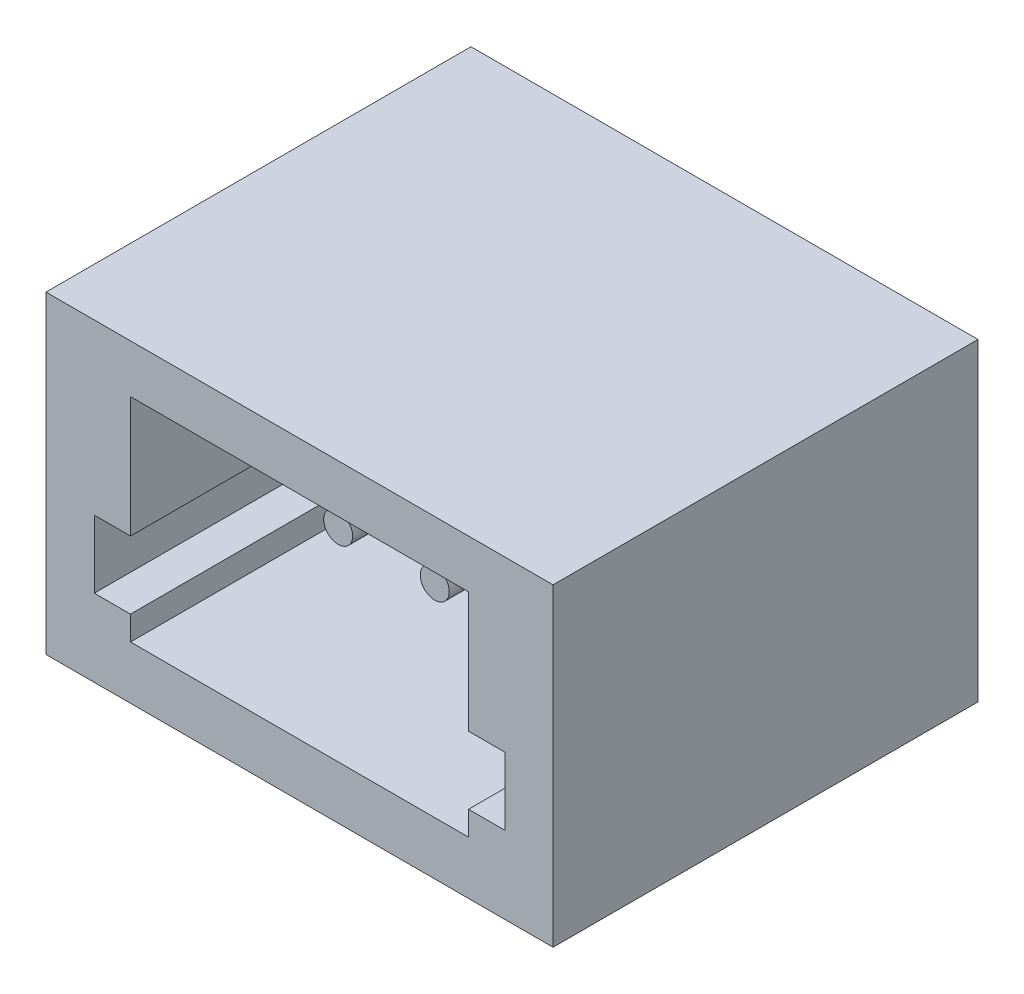
ISO-10303-21;
HEADER;
FILE_DESCRIPTION(('STEP AP214'),'2;1');
FILE_NAME('part.step','',(''),(''),'','','');
FILE_SCHEMA(('AUTOMOTIVE_DESIGN { 1 0 10303 214 1 1 1 1 }'));
ENDSEC;
DATA;
#1=APPLICATION_CONTEXT('core data for automotive mechanical design processes');
#2=APPLICATION_PROTOCOL_DEFINITION('international standard','automotive_design',2000,#1);
#3=PRODUCT_CONTEXT('',#1,'mechanical');
#4=PRODUCT('Part','Part','',(#3));
#5=PRODUCT_RELATED_PRODUCT_CATEGORY('part','',(#4));
#6=PRODUCT_DEFINITION_FORMATION('','',#4);
#7=PRODUCT_DEFINITION_CONTEXT('part definition',#1,'design');
#8=PRODUCT_DEFINITION('design','',#6,#7);
#9=PRODUCT_DEFINITION_SHAPE('','',#8);
#10=(LENGTH_UNIT() NAMED_UNIT(*) SI_UNIT(.MILLI.,.METRE.));
#11=(NAMED_UNIT(*) PLANE_ANGLE_UNIT() SI_UNIT($,.RADIAN.));
#12=(NAMED_UNIT(*) SI_UNIT($,.STERADIAN.) SOLID_ANGLE_UNIT());
#13=UNCERTAINTY_MEASURE_WITH_UNIT(LENGTH_MEASURE(1.E-05),#10,'distance_accuracy_value','');
#14=(GEOMETRIC_REPRESENTATION_CONTEXT(3) GLOBAL_UNCERTAINTY_ASSIGNED_CONTEXT((#13)) GLOBAL_UNIT_ASSIGNED_CONTEXT((#10,
#11,#12)) REPRESENTATION_CONTEXT('',''));
#15=CARTESIAN_POINT('',(0.,0.,0.));
#16=DIRECTION('',(0.,0.,1.));
#17=DIRECTION('',(1.,0.,0.));
#18=AXIS2_PLACEMENT_3D('',#15,#16,#17);
#19=CARTESIAN_POINT('',(62.80997635699,13.55049408494,-10.15));
#20=DIRECTION('',(1.,0.,0.));
#21=DIRECTION('',(0.,0.,-1.));
#22=AXIS2_PLACEMENT_3D('',#19,#20,#21);
#23=PLANE('',#22);
#24=DIRECTION('',(0.,-1.,0.));
#25=VECTOR('',#24,1.);
#26=CARTESIAN_POINT('',(62.80997635699,13.55049408494,-5.75));
#27=LINE('',#26,#25);
#28=CARTESIAN_POINT('',(62.80997635699,13.55049408494,-5.75));
#29=VERTEX_POINT('',#28);
#30=CARTESIAN_POINT('',(62.80997635699,10.30049408494,-5.75));
#31=VERTEX_POINT('',#30);
#32=EDGE_CURVE('E11',#29,#31,#27,.T.);
#33=ORIENTED_EDGE('',*,*,#32,.T.);
#34=DIRECTION('',(0.,0.,-1.));
#35=VECTOR('',#34,1.);
#36=CARTESIAN_POINT('',(62.80997635699,10.30049408494,-5.75));
#37=LINE('',#36,#35);
#38=CARTESIAN_POINT('',(62.80997635699,10.30049408494,-10.15));
#39=VERTEX_POINT('',#38);
#40=EDGE_CURVE('E27',#31,#39,#37,.T.);
#41=ORIENTED_EDGE('',*,*,#40,.T.);
#42=DIRECTION('',(0.,-1.,0.));
#43=VECTOR('',#42,1.);
#44=CARTESIAN_POINT('',(62.80997635699,13.55049408494,-10.15));
#45=LINE('',#44,#43);
#46=CARTESIAN_POINT('',(62.80997635699,13.55049408494,-10.15));
#47=VERTEX_POINT('',#46);
#48=EDGE_CURVE('E462',#47,#39,#45,.T.);
#49=ORIENTED_EDGE('',*,*,#48,.F.);
#50=DIRECTION('',(0.,0.,-1.));
#51=VECTOR('',#50,1.);
#52=CARTESIAN_POINT('',(62.80997635699,13.55049408494,-5.75));
#53=LINE('',#52,#51);
#54=EDGE_CURVE('E530',#29,#47,#53,.T.);
#55=ORIENTED_EDGE('',*,*,#54,.F.);
#56=EDGE_LOOP('',(#33,#41,#49,#55));
#57=FACE_BOUND('',#56,.T.);
#58=ADVANCED_FACE('F17',(#57),#23,.T.);
#59=CARTESIAN_POINT('',(57.55997635699,13.55049408494,-10.15));
#60=DIRECTION('',(0.,1.,0.));
#61=DIRECTION('',(0.,0.,1.));
#62=AXIS2_PLACEMENT_3D('',#59,#60,#61);
#63=PLANE('',#62);
#64=ORIENTED_EDGE('',*,*,#54,.T.);
#65=DIRECTION('',(1.,0.,0.));
#66=VECTOR('',#65,1.);
#67=CARTESIAN_POINT('',(57.55997635699,13.55049408494,-10.15));
#68=LINE('',#67,#66);
#69=CARTESIAN_POINT('',(57.55997635699,13.55049408494,-10.15));
#70=VERTEX_POINT('',#69);
#71=EDGE_CURVE('E459',#70,#47,#68,.T.);
#72=ORIENTED_EDGE('',*,*,#71,.F.);
#73=DIRECTION('',(0.,0.,-1.));
#74=VECTOR('',#73,1.);
#75=CARTESIAN_POINT('',(57.55997635699,13.55049408494,-5.75));
#76=LINE('',#75,#74);
#77=CARTESIAN_POINT('',(57.55997635699,13.55049408494,-5.75));
#78=VERTEX_POINT('',#77);
#79=EDGE_CURVE('E526',#78,#70,#76,.T.);
#80=ORIENTED_EDGE('',*,*,#79,.F.);
#81=DIRECTION('',(1.,0.,0.));
#82=VECTOR('',#81,1.);
#83=CARTESIAN_POINT('',(57.55997635699,13.55049408494,-5.75));
#84=LINE('',#83,#82);
#85=EDGE_CURVE('E525',#78,#29,#84,.T.);
#86=ORIENTED_EDGE('',*,*,#85,.T.);
#87=EDGE_LOOP('',(#64,#72,#80,#86));
#88=FACE_BOUND('',#87,.T.);
#89=ADVANCED_FACE('F195',(#88),#63,.T.);
#90=CARTESIAN_POINT('',(49.99345093786,14.29155013054,-5.75));
#91=DIRECTION('',(0.,0.,1.));
#92=DIRECTION('',(1.,0.,0.));
#93=AXIS2_PLACEMENT_3D('',#90,#91,#92);
#94=PLANE('',#93);
#95=DIRECTION('',(-1.,0.,0.));
#96=VECTOR('',#95,1.);
#97=CARTESIAN_POINT('',(62.80997635699,10.30049408494,-5.75));
#98=LINE('',#97,#96);
#99=CARTESIAN_POINT('',(57.55997635699,10.30049408494,-5.75));
#100=VERTEX_POINT('',#99);
#101=EDGE_CURVE('E458',#31,#100,#98,.T.);
#102=ORIENTED_EDGE('',*,*,#101,.F.);
#103=ORIENTED_EDGE('',*,*,#32,.F.);
#104=ORIENTED_EDGE('',*,*,#85,.F.);
#105=DIRECTION('',(0.,1.,0.));
#106=VECTOR('',#105,1.);
#107=CARTESIAN_POINT('',(57.55997635699,10.30049408494,-5.75));
#108=LINE('',#107,#106);
#109=EDGE_CURVE('E522',#100,#78,#108,.T.);
#110=ORIENTED_EDGE('',*,*,#109,.F.);
#111=EDGE_LOOP('',(#102,#103,#104,#110));
#112=FACE_BOUND('',#111,.T.);
#113=DIRECTION('',(0.,-1.,0.));
#114=VECTOR('',#113,1.);
#115=CARTESIAN_POINT('',(58.43497635699,13.05049408494,-5.75));
#116=LINE('',#115,#114);
#117=CARTESIAN_POINT('',(58.43497635699,13.05049408494,-5.75));
#118=VERTEX_POINT('',#117);
#119=CARTESIAN_POINT('',(58.43497635699,11.80049408494,-5.75));
#120=VERTEX_POINT('',#119);
#121=EDGE_CURVE('E468',#118,#120,#116,.T.);
#122=ORIENTED_EDGE('',*,*,#121,.F.);
#123=DIRECTION('',(-1.,0.,0.));
#124=VECTOR('',#123,1.);
#125=CARTESIAN_POINT('',(61.93497635699,13.05049408494,-5.75));
#126=LINE('',#125,#124);
#127=CARTESIAN_POINT('',(61.93497635699,13.05049408494,-5.75));
#128=VERTEX_POINT('',#127);
#129=EDGE_CURVE('E474',#128,#118,#126,.T.);
#130=ORIENTED_EDGE('',*,*,#129,.F.);
#131=DIRECTION('',(0.,1.,0.));
#132=VECTOR('',#131,1.);
#133=CARTESIAN_POINT('',(61.93497635699,11.80049408494,-5.75));
#134=LINE('',#133,#132);
#135=CARTESIAN_POINT('',(61.93497635699,11.80049408494,-5.75));
#136=VERTEX_POINT('',#135);
#137=EDGE_CURVE('E481',#136,#128,#134,.T.);
#138=ORIENTED_EDGE('',*,*,#137,.F.);
#139=DIRECTION('',(-1.,0.,0.));
#140=VECTOR('',#139,1.);
#141=CARTESIAN_POINT('',(62.30997635699,11.80049408494,-5.75));
#142=LINE('',#141,#140);
#143=CARTESIAN_POINT('',(62.30997635699,11.80049408494,-5.75));
#144=VERTEX_POINT('',#143);
#145=EDGE_CURVE('E488',#144,#136,#142,.T.);
#146=ORIENTED_EDGE('',*,*,#145,.F.);
#147=DIRECTION('',(0.,1.,0.));
#148=VECTOR('',#147,1.);
#149=CARTESIAN_POINT('',(62.30997635699,11.10049408494,-5.75));
#150=LINE('',#149,#148);
#151=CARTESIAN_POINT('',(62.30997635699,11.10049408494,-5.75));
#152=VERTEX_POINT('',#151);
#153=EDGE_CURVE('E495',#152,#144,#150,.T.);
#154=ORIENTED_EDGE('',*,*,#153,.F.);
#155=DIRECTION('',(1.,0.,0.));
#156=VECTOR('',#155,1.);
#157=CARTESIAN_POINT('',(61.93497635699,11.10049408494,-5.75));
#158=LINE('',#157,#156);
#159=CARTESIAN_POINT('',(61.93497635699,11.10049408494,-5.75));
#160=VERTEX_POINT('',#159);
#161=EDGE_CURVE('E502',#160,#152,#158,.T.);
#162=ORIENTED_EDGE('',*,*,#161,.F.);
#163=DIRECTION('',(0.,1.,0.));
#164=VECTOR('',#163,1.);
#165=CARTESIAN_POINT('',(61.93497635699,10.85049408494,-5.75));
#166=LINE('',#165,#164);
#167=CARTESIAN_POINT('',(61.93497635699,10.85049408494,-5.75));
#168=VERTEX_POINT('',#167);
#169=EDGE_CURVE('E508',#168,#160,#166,.T.);
#170=ORIENTED_EDGE('',*,*,#169,.F.);
#171=DIRECTION('',(1.,0.,0.));
#172=VECTOR('',#171,1.);
#173=CARTESIAN_POINT('',(58.43497635699,10.85049408494,-5.75));
#174=LINE('',#173,#172);
#175=CARTESIAN_POINT('',(58.43497635699,10.85049408494,-5.75));
#176=VERTEX_POINT('',#175);
#177=EDGE_CURVE('E433',#176,#168,#174,.T.);
#178=ORIENTED_EDGE('',*,*,#177,.F.);
#179=DIRECTION('',(0.,-1.,0.));
#180=VECTOR('',#179,1.);
#181=CARTESIAN_POINT('',(58.43497635699,11.10049408494,-5.75));
#182=LINE('',#181,#180);
#183=CARTESIAN_POINT('',(58.43497635699,11.10049408494,-5.75));
#184=VERTEX_POINT('',#183);
#185=EDGE_CURVE('E431',#184,#176,#182,.T.);
#186=ORIENTED_EDGE('',*,*,#185,.F.);
#187=DIRECTION('',(1.,0.,0.));
#188=VECTOR('',#187,1.);
#189=CARTESIAN_POINT('',(58.05997635699,11.10049408494,-5.75));
#190=LINE('',#189,#188);
#191=CARTESIAN_POINT('',(58.05997635699,11.10049408494,-5.75));
#192=VERTEX_POINT('',#191);
#193=EDGE_CURVE('E147',#192,#184,#190,.T.);
#194=ORIENTED_EDGE('',*,*,#193,.F.);
#195=DIRECTION('',(0.,-1.,0.));
#196=VECTOR('',#195,1.);
#197=CARTESIAN_POINT('',(58.05997635699,11.80049408494,-5.75));
#198=LINE('',#197,#196);
#199=CARTESIAN_POINT('',(58.05997635699,11.80049408494,-5.75));
#200=VERTEX_POINT('',#199);
#201=EDGE_CURVE('E145',#200,#192,#198,.T.);
#202=ORIENTED_EDGE('',*,*,#201,.F.);
#203=DIRECTION('',(-1.,0.,0.));
#204=VECTOR('',#203,1.);
#205=CARTESIAN_POINT('',(58.43497635699,11.80049408494,-5.75));
#206=LINE('',#205,#204);
#207=EDGE_CURVE('E446',#120,#200,#206,.T.);
#208=ORIENTED_EDGE('',*,*,#207,.F.);
#209=EDGE_LOOP('',(#122,#130,#138,#146,#154,#162,#170,#178,#186,#194,#202,#208));
#210=FACE_BOUND('',#209,.T.);
#211=ADVANCED_FACE('F201',(#112,#210),#94,.T.);
#212=CARTESIAN_POINT('',(57.55997635699,10.30049408494,-10.15));
#213=DIRECTION('',(-1.,0.,0.));
#214=DIRECTION('',(0.,0.,1.));
#215=AXIS2_PLACEMENT_3D('',#212,#213,#214);
#216=PLANE('',#215);
#217=ORIENTED_EDGE('',*,*,#109,.T.);
#218=ORIENTED_EDGE('',*,*,#79,.T.);
#219=DIRECTION('',(0.,1.,0.));
#220=VECTOR('',#219,1.);
#221=CARTESIAN_POINT('',(57.55997635699,10.30049408494,-10.15));
#222=LINE('',#221,#220);
#223=CARTESIAN_POINT('',(57.55997635699,10.30049408494,-10.15));
#224=VERTEX_POINT('',#223);
#225=EDGE_CURVE('E451',#224,#70,#222,.T.);
#226=ORIENTED_EDGE('',*,*,#225,.F.);
#227=DIRECTION('',(0.,0.,-1.));
#228=VECTOR('',#227,1.);
#229=CARTESIAN_POINT('',(57.55997635699,10.30049408494,-5.75));
#230=LINE('',#229,#228);
#231=EDGE_CURVE('E455',#100,#224,#230,.T.);
#232=ORIENTED_EDGE('',*,*,#231,.F.);
#233=EDGE_LOOP('',(#217,#218,#226,#232));
#234=FACE_BOUND('',#233,.T.);
#235=ADVANCED_FACE('F207',(#234),#216,.T.);
#236=CARTESIAN_POINT('',(62.80997635699,10.30049408494,-10.15));
#237=DIRECTION('',(0.,-1.,0.));
#238=DIRECTION('',(0.,0.,-1.));
#239=AXIS2_PLACEMENT_3D('',#236,#237,#238);
#240=PLANE('',#239);
#241=ORIENTED_EDGE('',*,*,#101,.T.);
#242=ORIENTED_EDGE('',*,*,#231,.T.);
#243=DIRECTION('',(-1.,0.,0.));
#244=VECTOR('',#243,1.);
#245=CARTESIAN_POINT('',(62.80997635699,10.30049408494,-10.15));
#246=LINE('',#245,#244);
#247=EDGE_CURVE('E454',#39,#224,#246,.T.);
#248=ORIENTED_EDGE('',*,*,#247,.F.);
#249=ORIENTED_EDGE('',*,*,#40,.F.);
#250=EDGE_LOOP('',(#241,#242,#248,#249));
#251=FACE_BOUND('',#250,.T.);
#252=ADVANCED_FACE('F211',(#251),#240,.T.);
#253=CARTESIAN_POINT('',(49.99345093786,14.29155013054,-10.15));
#254=DIRECTION('',(0.,0.,1.));
#255=DIRECTION('',(1.,0.,0.));
#256=AXIS2_PLACEMENT_3D('',#253,#254,#255);
#257=PLANE('',#256);
#258=ORIENTED_EDGE('',*,*,#71,.T.);
#259=ORIENTED_EDGE('',*,*,#48,.T.);
#260=ORIENTED_EDGE('',*,*,#247,.T.);
#261=ORIENTED_EDGE('',*,*,#225,.T.);
#262=EDGE_LOOP('',(#258,#259,#260,#261));
#263=FACE_BOUND('',#262,.T.);
#264=ADVANCED_FACE('F215',(#263),#257,.F.);
#265=CARTESIAN_POINT('',(58.43497635699,11.80049408494,-5.75));
#266=DIRECTION('',(0.,1.,0.));
#267=DIRECTION('',(-1.,0.,0.));
#268=AXIS2_PLACEMENT_3D('',#265,#266,#267);
#269=PLANE('',#268);
#270=DIRECTION('',(0.,0.,-1.));
#271=VECTOR('',#270,1.);
#272=CARTESIAN_POINT('',(58.05997635699,11.80049408494,-5.75));
#273=LINE('',#272,#271);
#274=CARTESIAN_POINT('',(58.05997635699,11.80049408494,-9.15));
#275=VERTEX_POINT('',#274);
#276=EDGE_CURVE('E449',#200,#275,#273,.T.);
#277=ORIENTED_EDGE('',*,*,#276,.T.);
#278=DIRECTION('',(-1.,0.,0.));
#279=VECTOR('',#278,1.);
#280=CARTESIAN_POINT('',(58.43497635699,11.80049408494,-9.15));
#281=LINE('',#280,#279);
#282=CARTESIAN_POINT('',(58.43497635699,11.80049408494,-9.15));
#283=VERTEX_POINT('',#282);
#284=EDGE_CURVE('E152',#283,#275,#281,.T.);
#285=ORIENTED_EDGE('',*,*,#284,.F.);
#286=DIRECTION('',(0.,0.,-1.));
#287=VECTOR('',#286,1.);
#288=CARTESIAN_POINT('',(58.43497635699,11.80049408494,-5.75));
#289=LINE('',#288,#287);
#290=EDGE_CURVE('E450',#120,#283,#289,.T.);
#291=ORIENTED_EDGE('',*,*,#290,.F.);
#292=ORIENTED_EDGE('',*,*,#207,.T.);
#293=EDGE_LOOP('',(#277,#285,#291,#292));
#294=FACE_BOUND('',#293,.T.);
#295=ADVANCED_FACE('F218',(#294),#269,.F.);
#296=CARTESIAN_POINT('',(58.43497635699,13.05049408494,-5.75));
#297=DIRECTION('',(-1.,0.,0.));
#298=DIRECTION('',(0.,-1.,0.));
#299=AXIS2_PLACEMENT_3D('',#296,#297,#298);
#300=PLANE('',#299);
#301=ORIENTED_EDGE('',*,*,#290,.T.);
#302=DIRECTION('',(0.,-1.,0.));
#303=VECTOR('',#302,1.);
#304=CARTESIAN_POINT('',(58.43497635699,13.05049408494,-9.15));
#305=LINE('',#304,#303);
#306=CARTESIAN_POINT('',(58.43497635699,13.05049408494,-9.15));
#307=VERTEX_POINT('',#306);
#308=EDGE_CURVE('E465',#307,#283,#305,.T.);
#309=ORIENTED_EDGE('',*,*,#308,.F.);
#310=DIRECTION('',(0.,0.,-1.));
#311=VECTOR('',#310,1.);
#312=CARTESIAN_POINT('',(58.43497635699,13.05049408494,-5.75));
#313=LINE('',#312,#311);
#314=EDGE_CURVE('E471',#118,#307,#313,.T.);
#315=ORIENTED_EDGE('',*,*,#314,.F.);
#316=ORIENTED_EDGE('',*,*,#121,.T.);
#317=EDGE_LOOP('',(#301,#309,#315,#316));
#318=FACE_BOUND('',#317,.T.);
#319=ADVANCED_FACE('F222',(#318),#300,.F.);
#320=CARTESIAN_POINT('',(61.93497635699,13.05049408494,-5.75));
#321=DIRECTION('',(0.,1.,0.));
#322=DIRECTION('',(-1.,0.,0.));
#323=AXIS2_PLACEMENT_3D('',#320,#321,#322);
#324=PLANE('',#323);
#325=ORIENTED_EDGE('',*,*,#314,.T.);
#326=DIRECTION('',(-1.,0.,0.));
#327=VECTOR('',#326,1.);
#328=CARTESIAN_POINT('',(61.93497635699,13.05049408494,-9.15));
#329=LINE('',#328,#327);
#330=CARTESIAN_POINT('',(61.93497635699,13.05049408494,-9.15));
#331=VERTEX_POINT('',#330);
#332=EDGE_CURVE('E470',#331,#307,#329,.T.);
#333=ORIENTED_EDGE('',*,*,#332,.F.);
#334=DIRECTION('',(0.,0.,-1.));
#335=VECTOR('',#334,1.);
#336=CARTESIAN_POINT('',(61.93497635699,13.05049408494,-5.75));
#337=LINE('',#336,#335);
#338=EDGE_CURVE('E478',#128,#331,#337,.T.);
#339=ORIENTED_EDGE('',*,*,#338,.F.);
#340=ORIENTED_EDGE('',*,*,#129,.T.);
#341=EDGE_LOOP('',(#325,#333,#339,#340));
#342=FACE_BOUND('',#341,.T.);
#343=ADVANCED_FACE('F226',(#342),#324,.F.);
#344=CARTESIAN_POINT('',(61.93497635699,11.80049408494,-5.75));
#345=DIRECTION('',(1.,0.,0.));
#346=DIRECTION('',(0.,1.,0.));
#347=AXIS2_PLACEMENT_3D('',#344,#345,#346);
#348=PLANE('',#347);
#349=ORIENTED_EDGE('',*,*,#338,.T.);
#350=DIRECTION('',(0.,1.,0.));
#351=VECTOR('',#350,1.);
#352=CARTESIAN_POINT('',(61.93497635699,11.80049408494,-9.15));
#353=LINE('',#352,#351);
#354=CARTESIAN_POINT('',(61.93497635699,11.80049408494,-9.15));
#355=VERTEX_POINT('',#354);
#356=EDGE_CURVE('E477',#355,#331,#353,.T.);
#357=ORIENTED_EDGE('',*,*,#356,.F.);
#358=DIRECTION('',(0.,0.,-1.));
#359=VECTOR('',#358,1.);
#360=CARTESIAN_POINT('',(61.93497635699,11.80049408494,-5.75));
#361=LINE('',#360,#359);
#362=EDGE_CURVE('E485',#136,#355,#361,.T.);
#363=ORIENTED_EDGE('',*,*,#362,.F.);
#364=ORIENTED_EDGE('',*,*,#137,.T.);
#365=EDGE_LOOP('',(#349,#357,#363,#364));
#366=FACE_BOUND('',#365,.T.);
#367=ADVANCED_FACE('F230',(#366),#348,.F.);
#368=CARTESIAN_POINT('',(62.30997635699,11.80049408494,-5.75));
#369=DIRECTION('',(0.,1.,0.));
#370=DIRECTION('',(-1.,0.,0.));
#371=AXIS2_PLACEMENT_3D('',#368,#369,#370);
#372=PLANE('',#371);
#373=ORIENTED_EDGE('',*,*,#362,.T.);
#374=DIRECTION('',(-1.,0.,0.));
#375=VECTOR('',#374,1.);
#376=CARTESIAN_POINT('',(62.30997635699,11.80049408494,-9.15));
#377=LINE('',#376,#375);
#378=CARTESIAN_POINT('',(62.30997635699,11.80049408494,-9.15));
#379=VERTEX_POINT('',#378);
#380=EDGE_CURVE('E484',#379,#355,#377,.T.);
#381=ORIENTED_EDGE('',*,*,#380,.F.);
#382=DIRECTION('',(0.,0.,-1.));
#383=VECTOR('',#382,1.);
#384=CARTESIAN_POINT('',(62.30997635699,11.80049408494,-5.75));
#385=LINE('',#384,#383);
#386=EDGE_CURVE('E492',#144,#379,#385,.T.);
#387=ORIENTED_EDGE('',*,*,#386,.F.);
#388=ORIENTED_EDGE('',*,*,#145,.T.);
#389=EDGE_LOOP('',(#373,#381,#387,#388));
#390=FACE_BOUND('',#389,.T.);
#391=ADVANCED_FACE('F234',(#390),#372,.F.);
#392=CARTESIAN_POINT('',(62.30997635699,11.10049408494,-5.75));
#393=DIRECTION('',(1.,0.,0.));
#394=DIRECTION('',(0.,1.,0.));
#395=AXIS2_PLACEMENT_3D('',#392,#393,#394);
#396=PLANE('',#395);
#397=ORIENTED_EDGE('',*,*,#386,.T.);
#398=DIRECTION('',(0.,1.,0.));
#399=VECTOR('',#398,1.);
#400=CARTESIAN_POINT('',(62.30997635699,11.10049408494,-9.15));
#401=LINE('',#400,#399);
#402=CARTESIAN_POINT('',(62.30997635699,11.10049408494,-9.15));
#403=VERTEX_POINT('',#402);
#404=EDGE_CURVE('E491',#403,#379,#401,.T.);
#405=ORIENTED_EDGE('',*,*,#404,.F.);
#406=DIRECTION('',(0.,0.,-1.));
#407=VECTOR('',#406,1.);
#408=CARTESIAN_POINT('',(62.30997635699,11.10049408494,-5.75));
#409=LINE('',#408,#407);
#410=EDGE_CURVE('E499',#152,#403,#409,.T.);
#411=ORIENTED_EDGE('',*,*,#410,.F.);
#412=ORIENTED_EDGE('',*,*,#153,.T.);
#413=EDGE_LOOP('',(#397,#405,#411,#412));
#414=FACE_BOUND('',#413,.T.);
#415=ADVANCED_FACE('F238',(#414),#396,.F.);
#416=CARTESIAN_POINT('',(61.93497635699,11.10049408494,-5.75));
#417=DIRECTION('',(0.,-1.,0.));
#418=DIRECTION('',(1.,0.,0.));
#419=AXIS2_PLACEMENT_3D('',#416,#417,#418);
#420=PLANE('',#419);
#421=ORIENTED_EDGE('',*,*,#410,.T.);
#422=DIRECTION('',(1.,0.,0.));
#423=VECTOR('',#422,1.);
#424=CARTESIAN_POINT('',(61.93497635699,11.10049408494,-9.15));
#425=LINE('',#424,#423);
#426=CARTESIAN_POINT('',(61.93497635699,11.10049408494,-9.15));
#427=VERTEX_POINT('',#426);
#428=EDGE_CURVE('E498',#427,#403,#425,.T.);
#429=ORIENTED_EDGE('',*,*,#428,.F.);
#430=DIRECTION('',(0.,0.,-1.));
#431=VECTOR('',#430,1.);
#432=CARTESIAN_POINT('',(61.93497635699,11.10049408494,-5.75));
#433=LINE('',#432,#431);
#434=EDGE_CURVE('E505',#160,#427,#433,.T.);
#435=ORIENTED_EDGE('',*,*,#434,.F.);
#436=ORIENTED_EDGE('',*,*,#161,.T.);
#437=EDGE_LOOP('',(#421,#429,#435,#436));
#438=FACE_BOUND('',#437,.T.);
#439=ADVANCED_FACE('F242',(#438),#420,.F.);
#440=CARTESIAN_POINT('',(61.93497635699,10.85049408494,-5.75));
#441=DIRECTION('',(1.,0.,0.));
#442=DIRECTION('',(0.,1.,0.));
#443=AXIS2_PLACEMENT_3D('',#440,#441,#442);
#444=PLANE('',#443);
#445=ORIENTED_EDGE('',*,*,#434,.T.);
#446=DIRECTION('',(0.,1.,0.));
#447=VECTOR('',#446,1.);
#448=CARTESIAN_POINT('',(61.93497635699,10.85049408494,-9.15));
#449=LINE('',#448,#447);
#450=CARTESIAN_POINT('',(61.93497635699,10.85049408494,-9.15));
#451=VERTEX_POINT('',#450);
#452=EDGE_CURVE('E439',#451,#427,#449,.T.);
#453=ORIENTED_EDGE('',*,*,#452,.F.);
#454=DIRECTION('',(0.,0.,-1.));
#455=VECTOR('',#454,1.);
#456=CARTESIAN_POINT('',(61.93497635699,10.85049408494,-5.75));
#457=LINE('',#456,#455);
#458=EDGE_CURVE('E510',#168,#451,#457,.T.);
#459=ORIENTED_EDGE('',*,*,#458,.F.);
#460=ORIENTED_EDGE('',*,*,#169,.T.);
#461=EDGE_LOOP('',(#445,#453,#459,#460));
#462=FACE_BOUND('',#461,.T.);
#463=ADVANCED_FACE('F246',(#462),#444,.F.);
#464=CARTESIAN_POINT('',(58.43497635699,10.85049408494,-5.75));
#465=DIRECTION('',(0.,-1.,0.));
#466=DIRECTION('',(1.,0.,0.));
#467=AXIS2_PLACEMENT_3D('',#464,#465,#466);
#468=PLANE('',#467);
#469=ORIENTED_EDGE('',*,*,#458,.T.);
#470=DIRECTION('',(1.,0.,0.));
#471=VECTOR('',#470,1.);
#472=CARTESIAN_POINT('',(58.43497635699,10.85049408494,-9.15));
#473=LINE('',#472,#471);
#474=CARTESIAN_POINT('',(58.43497635699,10.85049408494,-9.15));
#475=VERTEX_POINT('',#474);
#476=EDGE_CURVE('E437',#475,#451,#473,.T.);
#477=ORIENTED_EDGE('',*,*,#476,.F.);
#478=DIRECTION('',(0.,0.,-1.));
#479=VECTOR('',#478,1.);
#480=CARTESIAN_POINT('',(58.43497635699,10.85049408494,-5.75));
#481=LINE('',#480,#479);
#482=EDGE_CURVE('E429',#176,#475,#481,.T.);
#483=ORIENTED_EDGE('',*,*,#482,.F.);
#484=ORIENTED_EDGE('',*,*,#177,.T.);
#485=EDGE_LOOP('',(#469,#477,#483,#484));
#486=FACE_BOUND('',#485,.T.);
#487=ADVANCED_FACE('F250',(#486),#468,.F.);
#488=CARTESIAN_POINT('',(58.43497635699,11.10049408494,-5.75));
#489=DIRECTION('',(-1.,0.,0.));
#490=DIRECTION('',(0.,-1.,0.));
#491=AXIS2_PLACEMENT_3D('',#488,#489,#490);
#492=PLANE('',#491);
#493=ORIENTED_EDGE('',*,*,#482,.T.);
#494=DIRECTION('',(0.,-1.,0.));
#495=VECTOR('',#494,1.);
#496=CARTESIAN_POINT('',(58.43497635699,11.10049408494,-9.15));
#497=LINE('',#496,#495);
#498=CARTESIAN_POINT('',(58.43497635699,11.10049408494,-9.15));
#499=VERTEX_POINT('',#498);
#500=EDGE_CURVE('E126',#499,#475,#497,.T.);
#501=ORIENTED_EDGE('',*,*,#500,.F.);
#502=DIRECTION('',(0.,0.,-1.));
#503=VECTOR('',#502,1.);
#504=CARTESIAN_POINT('',(58.43497635699,11.10049408494,-5.75));
#505=LINE('',#504,#503);
#506=EDGE_CURVE('E136',#184,#499,#505,.T.);
#507=ORIENTED_EDGE('',*,*,#506,.F.);
#508=ORIENTED_EDGE('',*,*,#185,.T.);
#509=EDGE_LOOP('',(#493,#501,#507,#508));
#510=FACE_BOUND('',#509,.T.);
#511=ADVANCED_FACE('F254',(#510),#492,.F.);
#512=CARTESIAN_POINT('',(58.05997635699,11.10049408494,-5.75));
#513=DIRECTION('',(0.,-1.,0.));
#514=DIRECTION('',(1.,0.,0.));
#515=AXIS2_PLACEMENT_3D('',#512,#513,#514);
#516=PLANE('',#515);
#517=ORIENTED_EDGE('',*,*,#506,.T.);
#518=DIRECTION('',(1.,0.,0.));
#519=VECTOR('',#518,1.);
#520=CARTESIAN_POINT('',(58.05997635699,11.10049408494,-9.15));
#521=LINE('',#520,#519);
#522=CARTESIAN_POINT('',(58.05997635699,11.10049408494,-9.15));
#523=VERTEX_POINT('',#522);
#524=EDGE_CURVE('E132',#523,#499,#521,.T.);
#525=ORIENTED_EDGE('',*,*,#524,.F.);
#526=DIRECTION('',(0.,0.,-1.));
#527=VECTOR('',#526,1.);
#528=CARTESIAN_POINT('',(58.05997635699,11.10049408494,-5.75));
#529=LINE('',#528,#527);
#530=EDGE_CURVE('E135',#192,#523,#529,.T.);
#531=ORIENTED_EDGE('',*,*,#530,.F.);
#532=ORIENTED_EDGE('',*,*,#193,.T.);
#533=EDGE_LOOP('',(#517,#525,#531,#532));
#534=FACE_BOUND('',#533,.T.);
#535=ADVANCED_FACE('F134',(#534),#516,.F.);
#536=CARTESIAN_POINT('',(58.05997635699,11.80049408494,-5.75));
#537=DIRECTION('',(-1.,0.,0.));
#538=DIRECTION('',(0.,-1.,0.));
#539=AXIS2_PLACEMENT_3D('',#536,#537,#538);
#540=PLANE('',#539);
#541=ORIENTED_EDGE('',*,*,#530,.T.);
#542=DIRECTION('',(0.,-1.,0.));
#543=VECTOR('',#542,1.);
#544=CARTESIAN_POINT('',(58.05997635699,11.80049408494,-9.15));
#545=LINE('',#544,#543);
#546=EDGE_CURVE('E139',#275,#523,#545,.T.);
#547=ORIENTED_EDGE('',*,*,#546,.F.);
#548=ORIENTED_EDGE('',*,*,#276,.F.);
#549=ORIENTED_EDGE('',*,*,#201,.T.);
#550=EDGE_LOOP('',(#541,#547,#548,#549));
#551=FACE_BOUND('',#550,.T.);
#552=ADVANCED_FACE('F143',(#551),#540,.F.);
#553=CARTESIAN_POINT('',(0.,0.,-9.15));
#554=DIRECTION('',(0.,0.,1.));
#555=DIRECTION('',(1.,0.,0.));
#556=AXIS2_PLACEMENT_3D('',#553,#554,#555);
#557=PLANE('',#556);
#558=ORIENTED_EDGE('',*,*,#546,.T.);
#559=ORIENTED_EDGE('',*,*,#524,.T.);
#560=ORIENTED_EDGE('',*,*,#500,.T.);
#561=ORIENTED_EDGE('',*,*,#476,.T.);
#562=ORIENTED_EDGE('',*,*,#452,.T.);
#563=ORIENTED_EDGE('',*,*,#428,.T.);
#564=ORIENTED_EDGE('',*,*,#404,.T.);
#565=ORIENTED_EDGE('',*,*,#380,.T.);
#566=ORIENTED_EDGE('',*,*,#356,.T.);
#567=ORIENTED_EDGE('',*,*,#332,.T.);
#568=ORIENTED_EDGE('',*,*,#308,.T.);
#569=ORIENTED_EDGE('',*,*,#284,.T.);
#570=EDGE_LOOP('',(#558,#559,#560,#561,#562,#563,#564,#565,#566,#567,#568,#569));
#571=FACE_BOUND('',#570,.T.);
#572=CARTESIAN_POINT('',(60.18497635699,11.55049408494,-9.15));
#573=DIRECTION('',(0.,0.,1.));
#574=DIRECTION('',(-1.,0.,0.));
#575=AXIS2_PLACEMENT_3D('',#572,#573,#574);
#576=CIRCLE('',#575,0.15);
#577=CARTESIAN_POINT('',(60.03497635699,11.55049408494,-9.15));
#578=VERTEX_POINT('',#577);
#579=EDGE_CURVE('E157',#578,#578,#576,.T.);
#580=ORIENTED_EDGE('',*,*,#579,.F.);
#581=EDGE_LOOP('',(#580));
#582=FACE_BOUND('',#581,.T.);
#583=CARTESIAN_POINT('',(59.18497635699,11.55049408494,-9.15));
#584=DIRECTION('',(0.,0.,1.));
#585=DIRECTION('',(-1.,0.,0.));
#586=AXIS2_PLACEMENT_3D('',#583,#584,#585);
#587=CIRCLE('',#586,0.15);
#588=CARTESIAN_POINT('',(59.03497635699,11.55049408494,-9.15));
#589=VERTEX_POINT('',#588);
#590=EDGE_CURVE('E161',#589,#589,#587,.T.);
#591=ORIENTED_EDGE('',*,*,#590,.F.);
#592=EDGE_LOOP('',(#591));
#593=FACE_BOUND('',#592,.T.);
#594=CARTESIAN_POINT('',(61.18497635699,11.55049408494,-9.15));
#595=DIRECTION('',(0.,0.,1.));
#596=DIRECTION('',(-1.,0.,0.));
#597=AXIS2_PLACEMENT_3D('',#594,#595,#596);
#598=CIRCLE('',#597,0.15);
#599=CARTESIAN_POINT('',(61.03497635699,11.55049408494,-9.15));
#600=VERTEX_POINT('',#599);
#601=EDGE_CURVE('E164',#600,#600,#598,.T.);
#602=ORIENTED_EDGE('',*,*,#601,.F.);
#603=EDGE_LOOP('',(#602));
#604=FACE_BOUND('',#603,.T.);
#605=ADVANCED_FACE('F149',(#571,#582,#593,#604),#557,.T.);
#606=CARTESIAN_POINT('',(60.18497635699,11.55049408494,-9.15));
#607=DIRECTION('',(0.,0.,1.));
#608=DIRECTION('',(1.,0.,0.));
#609=AXIS2_PLACEMENT_3D('',#606,#607,#608);
#610=CYLINDRICAL_SURFACE('',#609,0.15);
#611=CARTESIAN_POINT('',(60.18497635699,11.55049408494,-7.15));
#612=DIRECTION('',(0.,0.,1.));
#613=DIRECTION('',(1.,0.,0.));
#614=AXIS2_PLACEMENT_3D('',#611,#612,#613);
#615=CIRCLE('',#614,0.15);
#616=CARTESIAN_POINT('',(60.33497635699,11.55049408494,-7.15));
#617=VERTEX_POINT('',#616);
#618=EDGE_CURVE('E160',#617,#617,#615,.T.);
#619=ORIENTED_EDGE('',*,*,#618,.F.);
#620=EDGE_LOOP('',(#619));
#621=FACE_BOUND('',#620,.T.);
#622=ORIENTED_EDGE('',*,*,#579,.T.);
#623=EDGE_LOOP('',(#622));
#624=FACE_BOUND('',#623,.T.);
#625=ADVANCED_FACE('F183',(#621,#624),#610,.T.);
#626=CARTESIAN_POINT('',(0.,0.,-7.15));
#627=DIRECTION('',(0.,0.,1.));
#628=DIRECTION('',(1.,0.,0.));
#629=AXIS2_PLACEMENT_3D('',#626,#627,#628);
#630=PLANE('',#629);
#631=ORIENTED_EDGE('',*,*,#618,.T.);
#632=EDGE_LOOP('',(#631));
#633=FACE_BOUND('',#632,.T.);
#634=ADVANCED_FACE('F190',(#633),#630,.T.);
#635=CARTESIAN_POINT('',(0.,0.,-7.15));
#636=DIRECTION('',(0.,0.,1.));
#637=DIRECTION('',(1.,0.,0.));
#638=AXIS2_PLACEMENT_3D('',#635,#636,#637);
#639=PLANE('',#638);
#640=CARTESIAN_POINT('',(59.18497635699,11.55049408494,-7.15));
#641=DIRECTION('',(0.,0.,1.));
#642=DIRECTION('',(-1.,0.,0.));
#643=AXIS2_PLACEMENT_3D('',#640,#641,#642);
#644=CIRCLE('',#643,0.15);
#645=CARTESIAN_POINT('',(59.03497635699,11.55049408494,-7.15));
#646=VERTEX_POINT('',#645);
#647=EDGE_CURVE('E168',#646,#646,#644,.T.);
#648=ORIENTED_EDGE('',*,*,#647,.T.);
#649=EDGE_LOOP('',(#648));
#650=FACE_BOUND('',#649,.T.);
#651=ADVANCED_FACE('F291',(#650),#639,.T.);
#652=CARTESIAN_POINT('',(0.,0.,-7.15));
#653=DIRECTION('',(0.,0.,1.));
#654=DIRECTION('',(1.,0.,0.));
#655=AXIS2_PLACEMENT_3D('',#652,#653,#654);
#656=PLANE('',#655);
#657=CARTESIAN_POINT('',(61.18497635699,11.55049408494,-7.15));
#658=DIRECTION('',(0.,0.,1.));
#659=DIRECTION('',(-1.,0.,0.));
#660=AXIS2_PLACEMENT_3D('',#657,#658,#659);
#661=CIRCLE('',#660,0.15);
#662=CARTESIAN_POINT('',(61.03497635699,11.55049408494,-7.15));
#663=VERTEX_POINT('',#662);
#664=EDGE_CURVE('E21',#663,#663,#661,.T.);
#665=ORIENTED_EDGE('',*,*,#664,.T.);
#666=EDGE_LOOP('',(#665));
#667=FACE_BOUND('',#666,.T.);
#668=ADVANCED_FACE('F175',(#667),#656,.T.);
#669=CARTESIAN_POINT('',(59.18497635699,11.55049408494,-9.15));
#670=DIRECTION('',(0.,0.,1.));
#671=DIRECTION('',(1.,0.,0.));
#672=AXIS2_PLACEMENT_3D('',#669,#670,#671);
#673=CYLINDRICAL_SURFACE('',#672,0.15);
#674=ORIENTED_EDGE('',*,*,#647,.F.);
#675=EDGE_LOOP('',(#674));
#676=FACE_BOUND('',#675,.T.);
#677=ORIENTED_EDGE('',*,*,#590,.T.);
#678=EDGE_LOOP('',(#677));
#679=FACE_BOUND('',#678,.T.);
#680=ADVANCED_FACE('F179',(#676,#679),#673,.T.);
#681=CARTESIAN_POINT('',(61.18497635699,11.55049408494,-9.15));
#682=DIRECTION('',(0.,0.,1.));
#683=DIRECTION('',(1.,0.,0.));
#684=AXIS2_PLACEMENT_3D('',#681,#682,#683);
#685=CYLINDRICAL_SURFACE('',#684,0.15);
#686=ORIENTED_EDGE('',*,*,#664,.F.);
#687=EDGE_LOOP('',(#686));
#688=FACE_BOUND('',#687,.T.);
#689=ORIENTED_EDGE('',*,*,#601,.T.);
#690=EDGE_LOOP('',(#689));
#691=FACE_BOUND('',#690,.T.);
#692=ADVANCED_FACE('F19',(#688,#691),#685,.T.);
#693=CLOSED_SHELL('',(#58,#89,#211,#235,#252,#264,#295,#319,#343,#367,#391,#415,#439,#463,#487,
#511,#535,#552,#605,#625,#634,#651,#668,#680,#692));
#694=MANIFOLD_SOLID_BREP('B1',#693);
#695=ADVANCED_BREP_SHAPE_REPRESENTATION('',(#18,#694),#14);
#696=SHAPE_DEFINITION_REPRESENTATION(#9,#695);
ENDSEC;
END-ISO-10303-21;
